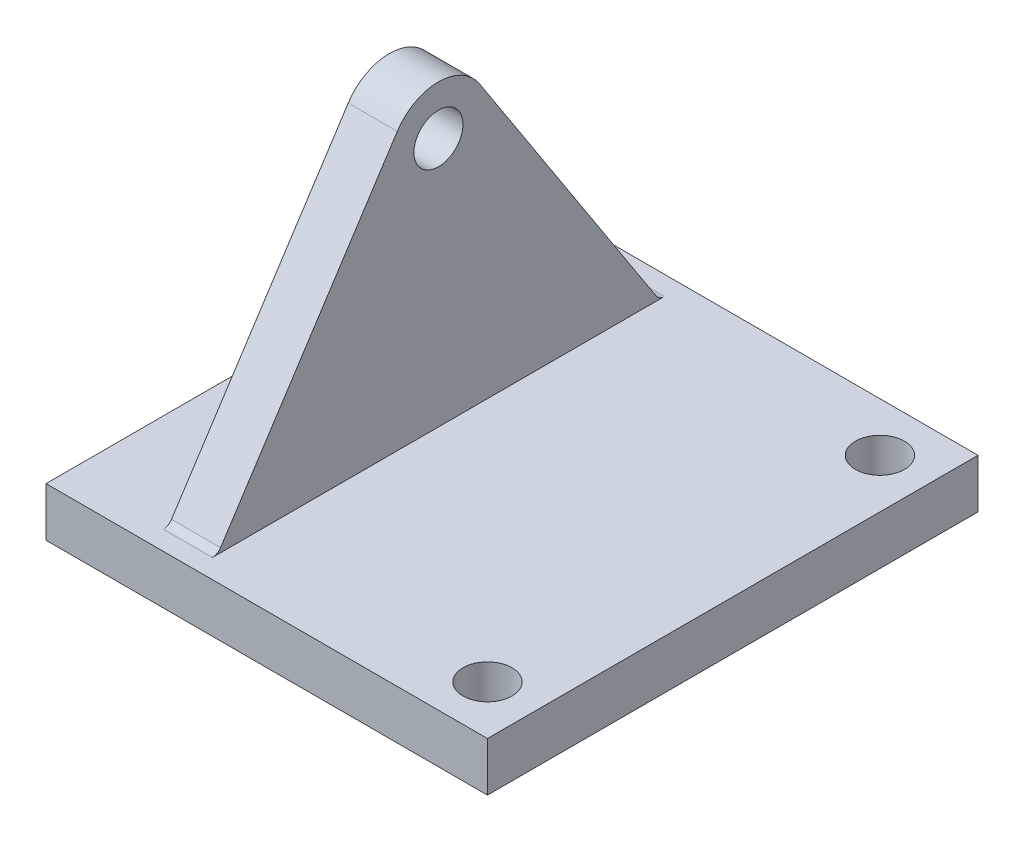
ISO-10303-21;
HEADER;
FILE_DESCRIPTION(('STEP AP214'),'2;1');
FILE_NAME('part.step','',(''),(''),'','','');
FILE_SCHEMA(('AUTOMOTIVE_DESIGN { 1 0 10303 214 1 1 1 1 }'));
ENDSEC;
DATA;
#1=APPLICATION_CONTEXT('core data for automotive mechanical design processes');
#2=APPLICATION_PROTOCOL_DEFINITION('international standard','automotive_design',2000,#1);
#3=PRODUCT_CONTEXT('',#1,'mechanical');
#4=PRODUCT('Part','Part','',(#3));
#5=PRODUCT_RELATED_PRODUCT_CATEGORY('part','',(#4));
#6=PRODUCT_DEFINITION_FORMATION('','',#4);
#7=PRODUCT_DEFINITION_CONTEXT('part definition',#1,'design');
#8=PRODUCT_DEFINITION('design','',#6,#7);
#9=PRODUCT_DEFINITION_SHAPE('','',#8);
#10=(LENGTH_UNIT() NAMED_UNIT(*) SI_UNIT(.MILLI.,.METRE.));
#11=(NAMED_UNIT(*) PLANE_ANGLE_UNIT() SI_UNIT($,.RADIAN.));
#12=(NAMED_UNIT(*) SI_UNIT($,.STERADIAN.) SOLID_ANGLE_UNIT());
#13=UNCERTAINTY_MEASURE_WITH_UNIT(LENGTH_MEASURE(1.E-05),#10,'distance_accuracy_value','');
#14=(GEOMETRIC_REPRESENTATION_CONTEXT(3) GLOBAL_UNCERTAINTY_ASSIGNED_CONTEXT((#13)) GLOBAL_UNIT_ASSIGNED_CONTEXT((#10,
#11,#12)) REPRESENTATION_CONTEXT('',''));
#15=CARTESIAN_POINT('',(0.,0.,0.));
#16=DIRECTION('',(0.,0.,1.));
#17=DIRECTION('',(1.,0.,0.));
#18=AXIS2_PLACEMENT_3D('',#15,#16,#17);
#19=CARTESIAN_POINT('',(-20.,-5.,0.));
#20=DIRECTION('',(0.,-1.,0.));
#21=DIRECTION('',(0.,0.,-1.));
#22=AXIS2_PLACEMENT_3D('',#19,#20,#21);
#23=PLANE('',#22);
#24=CARTESIAN_POINT('',(60.,-5.,-40.));
#25=DIRECTION('',(0.,1.,0.));
#26=DIRECTION('',(0.,0.,1.));
#27=AXIS2_PLACEMENT_3D('',#24,#25,#26);
#28=CIRCLE('',#27,5.);
#29=CARTESIAN_POINT('',(60.,-5.,-35.));
#30=VERTEX_POINT('',#29);
#31=EDGE_CURVE('E140',#30,#30,#28,.T.);
#32=ORIENTED_EDGE('',*,*,#31,.T.);
#33=EDGE_LOOP('',(#32));
#34=FACE_BOUND('',#33,.T.);
#35=DIRECTION('',(1.,0.,0.));
#36=VECTOR('',#35,1.);
#37=CARTESIAN_POINT('',(-20.,-5.,-50.));
#38=LINE('',#37,#36);
#39=CARTESIAN_POINT('',(-20.,-5.,-50.));
#40=VERTEX_POINT('',#39);
#41=CARTESIAN_POINT('',(70.,-5.,-50.));
#42=VERTEX_POINT('',#41);
#43=EDGE_CURVE('E111',#40,#42,#38,.T.);
#44=ORIENTED_EDGE('',*,*,#43,.T.);
#45=DIRECTION('',(0.,0.,-1.));
#46=VECTOR('',#45,1.);
#47=CARTESIAN_POINT('',(70.,-5.,0.));
#48=LINE('',#47,#46);
#49=CARTESIAN_POINT('',(70.,-5.,50.));
#50=VERTEX_POINT('',#49);
#51=EDGE_CURVE('E115',#50,#42,#48,.T.);
#52=ORIENTED_EDGE('',*,*,#51,.F.);
#53=DIRECTION('',(1.,0.,0.));
#54=VECTOR('',#53,1.);
#55=CARTESIAN_POINT('',(-20.,-5.,50.));
#56=LINE('',#55,#54);
#57=CARTESIAN_POINT('',(-20.,-5.,50.));
#58=VERTEX_POINT('',#57);
#59=EDGE_CURVE('E152',#58,#50,#56,.T.);
#60=ORIENTED_EDGE('',*,*,#59,.F.);
#61=DIRECTION('',(0.,0.,-1.));
#62=VECTOR('',#61,1.);
#63=CARTESIAN_POINT('',(-20.,-5.,0.));
#64=LINE('',#63,#62);
#65=EDGE_CURVE('E118',#58,#40,#64,.T.);
#66=ORIENTED_EDGE('',*,*,#65,.T.);
#67=EDGE_LOOP('',(#44,#52,#60,#66));
#68=FACE_BOUND('',#67,.T.);
#69=CARTESIAN_POINT('',(60.,-5.,40.));
#70=DIRECTION('',(0.,1.,0.));
#71=DIRECTION('',(0.,0.,1.));
#72=AXIS2_PLACEMENT_3D('',#69,#70,#71);
#73=CIRCLE('',#72,5.);
#74=CARTESIAN_POINT('',(60.,-5.,45.));
#75=VERTEX_POINT('',#74);
#76=EDGE_CURVE('E277',#75,#75,#73,.T.);
#77=ORIENTED_EDGE('',*,*,#76,.T.);
#78=EDGE_LOOP('',(#77));
#79=FACE_BOUND('',#78,.T.);
#80=ADVANCED_FACE('F35',(#34,#68,#79),#23,.T.);
#81=CARTESIAN_POINT('',(-20.,5.,0.));
#82=DIRECTION('',(0.,-1.,0.));
#83=DIRECTION('',(0.,0.,-1.));
#84=AXIS2_PLACEMENT_3D('',#81,#82,#83);
#85=PLANE('',#84);
#86=CARTESIAN_POINT('',(60.,5.,-40.));
#87=DIRECTION('',(0.,1.,0.));
#88=DIRECTION('',(0.,0.,1.));
#89=AXIS2_PLACEMENT_3D('',#86,#87,#88);
#90=CIRCLE('',#89,5.);
#91=CARTESIAN_POINT('',(60.,5.,-35.));
#92=VERTEX_POINT('',#91);
#93=EDGE_CURVE('E137',#92,#92,#90,.T.);
#94=ORIENTED_EDGE('',*,*,#93,.F.);
#95=EDGE_LOOP('',(#94));
#96=FACE_BOUND('',#95,.T.);
#97=DIRECTION('',(-1.,0.,0.));
#98=VECTOR('',#97,1.);
#99=CARTESIAN_POINT('',(-20.,5.,46.0859434255799));
#100=LINE('',#99,#98);
#101=CARTESIAN_POINT('',(10.,5.,46.0859434255799));
#102=VERTEX_POINT('',#101);
#103=CARTESIAN_POINT('',(0.,5.,46.0859434255799));
#104=VERTEX_POINT('',#103);
#105=EDGE_CURVE('E190',#102,#104,#100,.T.);
#106=ORIENTED_EDGE('',*,*,#105,.T.);
#107=DIRECTION('',(0.,0.,-1.));
#108=VECTOR('',#107,1.);
#109=CARTESIAN_POINT('',(0.,5.,0.));
#110=LINE('',#109,#108);
#111=CARTESIAN_POINT('',(0.,5.,-46.08594342558));
#112=VERTEX_POINT('',#111);
#113=EDGE_CURVE('E162',#104,#112,#110,.T.);
#114=ORIENTED_EDGE('',*,*,#113,.T.);
#115=DIRECTION('',(-1.,0.,0.));
#116=VECTOR('',#115,1.);
#117=CARTESIAN_POINT('',(10.,5.,-46.08594342558));
#118=LINE('',#117,#116);
#119=CARTESIAN_POINT('',(10.,5.,-46.08594342558));
#120=VERTEX_POINT('',#119);
#121=EDGE_CURVE('E187',#112,#120,#118,.F.);
#122=ORIENTED_EDGE('',*,*,#121,.T.);
#123=DIRECTION('',(0.,0.,-1.));
#124=VECTOR('',#123,1.);
#125=CARTESIAN_POINT('',(10.,5.,0.));
#126=LINE('',#125,#124);
#127=EDGE_CURVE('E169',#102,#120,#126,.T.);
#128=ORIENTED_EDGE('',*,*,#127,.F.);
#129=EDGE_LOOP('',(#106,#114,#122,#128));
#130=FACE_BOUND('',#129,.T.);
#131=DIRECTION('',(1.,0.,0.));
#132=VECTOR('',#131,1.);
#133=CARTESIAN_POINT('',(-20.,5.,50.));
#134=LINE('',#133,#132);
#135=CARTESIAN_POINT('',(-20.,5.,50.));
#136=VERTEX_POINT('',#135);
#137=CARTESIAN_POINT('',(70.,5.,50.));
#138=VERTEX_POINT('',#137);
#139=EDGE_CURVE('E155',#136,#138,#134,.T.);
#140=ORIENTED_EDGE('',*,*,#139,.T.);
#141=DIRECTION('',(0.,0.,-1.));
#142=VECTOR('',#141,1.);
#143=CARTESIAN_POINT('',(70.,5.,0.));
#144=LINE('',#143,#142);
#145=CARTESIAN_POINT('',(70.,5.,-50.));
#146=VERTEX_POINT('',#145);
#147=EDGE_CURVE('E132',#138,#146,#144,.T.);
#148=ORIENTED_EDGE('',*,*,#147,.T.);
#149=DIRECTION('',(1.,0.,0.));
#150=VECTOR('',#149,1.);
#151=CARTESIAN_POINT('',(-20.,5.,-50.));
#152=LINE('',#151,#150);
#153=CARTESIAN_POINT('',(-20.,5.,-50.));
#154=VERTEX_POINT('',#153);
#155=EDGE_CURVE('E122',#154,#146,#152,.T.);
#156=ORIENTED_EDGE('',*,*,#155,.F.);
#157=DIRECTION('',(0.,0.,-1.));
#158=VECTOR('',#157,1.);
#159=CARTESIAN_POINT('',(-20.,5.,0.));
#160=LINE('',#159,#158);
#161=EDGE_CURVE('E149',#136,#154,#160,.T.);
#162=ORIENTED_EDGE('',*,*,#161,.F.);
#163=EDGE_LOOP('',(#140,#148,#156,#162));
#164=FACE_BOUND('',#163,.T.);
#165=CARTESIAN_POINT('',(60.,5.,40.));
#166=DIRECTION('',(0.,1.,0.));
#167=DIRECTION('',(0.,0.,1.));
#168=AXIS2_PLACEMENT_3D('',#165,#166,#167);
#169=CIRCLE('',#168,5.);
#170=CARTESIAN_POINT('',(60.,5.,45.));
#171=VERTEX_POINT('',#170);
#172=EDGE_CURVE('E274',#171,#171,#169,.T.);
#173=ORIENTED_EDGE('',*,*,#172,.F.);
#174=EDGE_LOOP('',(#173));
#175=FACE_BOUND('',#174,.T.);
#176=ADVANCED_FACE('F207',(#96,#130,#164,#175),#85,.F.);
#177=CARTESIAN_POINT('',(10.,22.0373654685831,-33.936404616269));
#178=DIRECTION('',(0.,-0.544618290857901,0.838684038993838));
#179=DIRECTION('',(0.,-0.838684038993838,-0.544618290857901));
#180=AXIS2_PLACEMENT_3D('',#177,#178,#179);
#181=PLANE('',#180);
#182=DIRECTION('',(0.,0.838684038993838,0.544618290857901));
#183=VECTOR('',#182,1.);
#184=CARTESIAN_POINT('',(10.,22.0373654685831,-33.936404616269));
#185=LINE('',#184,#183);
#186=CARTESIAN_POINT('',(10.,5.9107634182842,-44.4085753475923));
#187=VERTEX_POINT('',#186);
#188=CARTESIAN_POINT('',(10.,61.3823747706344,-8.38684038993839));
#189=VERTEX_POINT('',#188);
#190=EDGE_CURVE('E161',#187,#189,#185,.T.);
#191=ORIENTED_EDGE('',*,*,#190,.F.);
#192=DIRECTION('',(-1.,0.,0.));
#193=VECTOR('',#192,1.);
#194=CARTESIAN_POINT('',(0.,5.9107634182842,-44.4085753475923));
#195=LINE('',#194,#193);
#196=CARTESIAN_POINT('',(0.,5.9107634182842,-44.4085753475923));
#197=VERTEX_POINT('',#196);
#198=EDGE_CURVE('E195',#187,#197,#195,.T.);
#199=ORIENTED_EDGE('',*,*,#198,.T.);
#200=DIRECTION('',(0.,0.838684038993838,0.544618290857901));
#201=VECTOR('',#200,1.);
#202=CARTESIAN_POINT('',(0.,22.0373654685831,-33.936404616269));
#203=LINE('',#202,#201);
#204=CARTESIAN_POINT('',(0.,61.3823747706344,-8.38684038993839));
#205=VERTEX_POINT('',#204);
#206=EDGE_CURVE('E174',#197,#205,#203,.T.);
#207=ORIENTED_EDGE('',*,*,#206,.T.);
#208=DIRECTION('',(-1.,0.,0.));
#209=VECTOR('',#208,1.);
#210=CARTESIAN_POINT('',(10.,61.3823747706344,-8.38684038993839));
#211=LINE('',#210,#209);
#212=EDGE_CURVE('E184',#189,#205,#211,.T.);
#213=ORIENTED_EDGE('',*,*,#212,.F.);
#214=EDGE_LOOP('',(#191,#199,#207,#213));
#215=FACE_BOUND('',#214,.T.);
#216=ADVANCED_FACE('F224',(#215),#181,.F.);
#217=CARTESIAN_POINT('',(10.,55.9361918620554,0.));
#218=DIRECTION('',(-1.,0.,0.));
#219=DIRECTION('',(0.,0.,1.));
#220=AXIS2_PLACEMENT_3D('',#217,#218,#219);
#221=CYLINDRICAL_SURFACE('',#220,9.99999999999999);
#222=CARTESIAN_POINT('',(0.,55.9361918620554,0.));
#223=DIRECTION('',(1.,0.,0.));
#224=DIRECTION('',(0.,0.,-1.));
#225=AXIS2_PLACEMENT_3D('',#222,#223,#224);
#226=CIRCLE('',#225,9.99999999999999);
#227=CARTESIAN_POINT('',(0.,61.3823747706344,8.38684038993835));
#228=VERTEX_POINT('',#227);
#229=EDGE_CURVE('E176',#205,#228,#226,.T.);
#230=ORIENTED_EDGE('',*,*,#229,.T.);
#231=DIRECTION('',(-1.,0.,0.));
#232=VECTOR('',#231,1.);
#233=CARTESIAN_POINT('',(10.,61.3823747706344,8.38684038993835));
#234=LINE('',#233,#232);
#235=CARTESIAN_POINT('',(10.,61.3823747706344,8.38684038993835));
#236=VERTEX_POINT('',#235);
#237=EDGE_CURVE('E171',#236,#228,#234,.T.);
#238=ORIENTED_EDGE('',*,*,#237,.F.);
#239=CARTESIAN_POINT('',(10.,55.9361918620554,0.));
#240=DIRECTION('',(1.,0.,0.));
#241=DIRECTION('',(0.,0.,-1.));
#242=AXIS2_PLACEMENT_3D('',#239,#240,#241);
#243=CIRCLE('',#242,9.99999999999999);
#244=EDGE_CURVE('E164',#189,#236,#243,.T.);
#245=ORIENTED_EDGE('',*,*,#244,.F.);
#246=ORIENTED_EDGE('',*,*,#212,.T.);
#247=EDGE_LOOP('',(#230,#238,#245,#246));
#248=FACE_BOUND('',#247,.T.);
#249=ADVANCED_FACE('F221',(#248),#221,.T.);
#250=CARTESIAN_POINT('',(10.,22.0373654685831,33.936404616269));
#251=DIRECTION('',(0.,0.544618290857901,0.838684038993838));
#252=DIRECTION('',(0.,-0.838684038993838,0.544618290857901));
#253=AXIS2_PLACEMENT_3D('',#250,#251,#252);
#254=PLANE('',#253);
#255=DIRECTION('',(0.,0.838684038993838,-0.544618290857901));
#256=VECTOR('',#255,1.);
#257=CARTESIAN_POINT('',(0.,22.0373654685831,33.936404616269));
#258=LINE('',#257,#256);
#259=CARTESIAN_POINT('',(0.,5.9107634182842,44.4085753475923));
#260=VERTEX_POINT('',#259);
#261=EDGE_CURVE('E179',#260,#228,#258,.T.);
#262=ORIENTED_EDGE('',*,*,#261,.F.);
#263=DIRECTION('',(-1.,0.,0.));
#264=VECTOR('',#263,1.);
#265=CARTESIAN_POINT('',(10.,5.9107634182842,44.4085753475923));
#266=LINE('',#265,#264);
#267=CARTESIAN_POINT('',(10.,5.9107634182842,44.4085753475923));
#268=VERTEX_POINT('',#267);
#269=EDGE_CURVE('E193',#260,#268,#266,.F.);
#270=ORIENTED_EDGE('',*,*,#269,.T.);
#271=DIRECTION('',(0.,0.838684038993838,-0.544618290857901));
#272=VECTOR('',#271,1.);
#273=CARTESIAN_POINT('',(10.,22.0373654685831,33.936404616269));
#274=LINE('',#273,#272);
#275=EDGE_CURVE('E167',#268,#236,#274,.T.);
#276=ORIENTED_EDGE('',*,*,#275,.T.);
#277=ORIENTED_EDGE('',*,*,#237,.T.);
#278=EDGE_LOOP('',(#262,#270,#276,#277));
#279=FACE_BOUND('',#278,.T.);
#280=ADVANCED_FACE('F216',(#279),#254,.T.);
#281=CARTESIAN_POINT('',(10.,55.9361918620554,0.));
#282=DIRECTION('',(-1.,0.,0.));
#283=DIRECTION('',(0.,0.,1.));
#284=AXIS2_PLACEMENT_3D('',#281,#282,#283);
#285=CYLINDRICAL_SURFACE('',#284,5.);
#286=CARTESIAN_POINT('',(10.,55.9361918620554,0.));
#287=DIRECTION('',(1.,0.,0.));
#288=DIRECTION('',(0.,0.,-1.));
#289=AXIS2_PLACEMENT_3D('',#286,#287,#288);
#290=CIRCLE('',#289,5.);
#291=CARTESIAN_POINT('',(10.,55.9361918620554,-5.00000000000001));
#292=VERTEX_POINT('',#291);
#293=EDGE_CURVE('E158',#292,#292,#290,.T.);
#294=ORIENTED_EDGE('',*,*,#293,.T.);
#295=EDGE_LOOP('',(#294));
#296=FACE_BOUND('',#295,.T.);
#297=CARTESIAN_POINT('',(0.,55.9361918620554,0.));
#298=DIRECTION('',(1.,0.,0.));
#299=DIRECTION('',(0.,0.,-1.));
#300=AXIS2_PLACEMENT_3D('',#297,#298,#299);
#301=CIRCLE('',#300,5.);
#302=CARTESIAN_POINT('',(0.,55.9361918620554,-5.00000000000001));
#303=VERTEX_POINT('',#302);
#304=EDGE_CURVE('E154',#303,#303,#301,.T.);
#305=ORIENTED_EDGE('',*,*,#304,.F.);
#306=EDGE_LOOP('',(#305));
#307=FACE_BOUND('',#306,.T.);
#308=ADVANCED_FACE('F227',(#296,#307),#285,.F.);
#309=CARTESIAN_POINT('',(10.,0.,0.));
#310=DIRECTION('',(1.,0.,0.));
#311=DIRECTION('',(0.,0.,-1.));
#312=AXIS2_PLACEMENT_3D('',#309,#310,#311);
#313=PLANE('',#312);
#314=ORIENTED_EDGE('',*,*,#293,.F.);
#315=EDGE_LOOP('',(#314));
#316=FACE_BOUND('',#315,.T.);
#317=ORIENTED_EDGE('',*,*,#127,.T.);
#318=CARTESIAN_POINT('',(10.,7.,-46.08594342558));
#319=DIRECTION('',(1.,0.,0.));
#320=DIRECTION('',(0.,0.,-1.));
#321=AXIS2_PLACEMENT_3D('',#318,#319,#320);
#322=CIRCLE('',#321,2.);
#323=EDGE_CURVE('E11',#120,#187,#322,.F.);
#324=ORIENTED_EDGE('',*,*,#323,.T.);
#325=ORIENTED_EDGE('',*,*,#190,.T.);
#326=ORIENTED_EDGE('',*,*,#244,.T.);
#327=ORIENTED_EDGE('',*,*,#275,.F.);
#328=CARTESIAN_POINT('',(10.,7.,46.0859434255799));
#329=DIRECTION('',(1.,0.,0.));
#330=DIRECTION('',(0.,0.,-1.));
#331=AXIS2_PLACEMENT_3D('',#328,#329,#330);
#332=CIRCLE('',#331,2.);
#333=EDGE_CURVE('E199',#268,#102,#332,.F.);
#334=ORIENTED_EDGE('',*,*,#333,.T.);
#335=EDGE_LOOP('',(#317,#324,#325,#326,#327,#334));
#336=FACE_BOUND('',#335,.T.);
#337=ADVANCED_FACE('F225',(#316,#336),#313,.T.);
#338=CARTESIAN_POINT('',(0.,0.,0.));
#339=DIRECTION('',(1.,0.,0.));
#340=DIRECTION('',(0.,0.,-1.));
#341=AXIS2_PLACEMENT_3D('',#338,#339,#340);
#342=PLANE('',#341);
#343=ORIENTED_EDGE('',*,*,#304,.T.);
#344=EDGE_LOOP('',(#343));
#345=FACE_BOUND('',#344,.T.);
#346=ORIENTED_EDGE('',*,*,#206,.F.);
#347=CARTESIAN_POINT('',(0.,7.,-46.08594342558));
#348=DIRECTION('',(1.,0.,0.));
#349=DIRECTION('',(0.,0.,-1.));
#350=AXIS2_PLACEMENT_3D('',#347,#348,#349);
#351=CIRCLE('',#350,2.);
#352=EDGE_CURVE('E43',#197,#112,#351,.T.);
#353=ORIENTED_EDGE('',*,*,#352,.T.);
#354=ORIENTED_EDGE('',*,*,#113,.F.);
#355=CARTESIAN_POINT('',(0.,7.,46.0859434255799));
#356=DIRECTION('',(1.,0.,0.));
#357=DIRECTION('',(0.,0.,-1.));
#358=AXIS2_PLACEMENT_3D('',#355,#356,#357);
#359=CIRCLE('',#358,2.);
#360=EDGE_CURVE('E197',#104,#260,#359,.T.);
#361=ORIENTED_EDGE('',*,*,#360,.T.);
#362=ORIENTED_EDGE('',*,*,#261,.T.);
#363=ORIENTED_EDGE('',*,*,#229,.F.);
#364=EDGE_LOOP('',(#346,#353,#354,#361,#362,#363));
#365=FACE_BOUND('',#364,.T.);
#366=ADVANCED_FACE('F203',(#345,#365),#342,.F.);
#367=CARTESIAN_POINT('',(-20.,0.,50.));
#368=DIRECTION('',(0.,0.,-1.));
#369=DIRECTION('',(-1.,0.,0.));
#370=AXIS2_PLACEMENT_3D('',#367,#368,#369);
#371=PLANE('',#370);
#372=ORIENTED_EDGE('',*,*,#59,.T.);
#373=DIRECTION('',(0.,1.,0.));
#374=VECTOR('',#373,1.);
#375=CARTESIAN_POINT('',(70.,0.,50.));
#376=LINE('',#375,#374);
#377=EDGE_CURVE('E136',#50,#138,#376,.T.);
#378=ORIENTED_EDGE('',*,*,#377,.T.);
#379=ORIENTED_EDGE('',*,*,#139,.F.);
#380=DIRECTION('',(0.,1.,0.));
#381=VECTOR('',#380,1.);
#382=CARTESIAN_POINT('',(-20.,0.,50.));
#383=LINE('',#382,#381);
#384=EDGE_CURVE('E123',#58,#136,#383,.T.);
#385=ORIENTED_EDGE('',*,*,#384,.F.);
#386=EDGE_LOOP('',(#372,#378,#379,#385));
#387=FACE_BOUND('',#386,.T.);
#388=ADVANCED_FACE('F234',(#387),#371,.F.);
#389=CARTESIAN_POINT('',(-20.,0.,-50.));
#390=DIRECTION('',(0.,0.,-1.));
#391=DIRECTION('',(0.,1.,0.));
#392=AXIS2_PLACEMENT_3D('',#389,#390,#391);
#393=PLANE('',#392);
#394=ORIENTED_EDGE('',*,*,#155,.T.);
#395=DIRECTION('',(0.,1.,0.));
#396=VECTOR('',#395,1.);
#397=CARTESIAN_POINT('',(70.,0.,-50.));
#398=LINE('',#397,#396);
#399=EDGE_CURVE('E126',#42,#146,#398,.T.);
#400=ORIENTED_EDGE('',*,*,#399,.F.);
#401=ORIENTED_EDGE('',*,*,#43,.F.);
#402=DIRECTION('',(0.,1.,0.));
#403=VECTOR('',#402,1.);
#404=CARTESIAN_POINT('',(-20.,0.,-50.));
#405=LINE('',#404,#403);
#406=EDGE_CURVE('E147',#40,#154,#405,.T.);
#407=ORIENTED_EDGE('',*,*,#406,.T.);
#408=EDGE_LOOP('',(#394,#400,#401,#407));
#409=FACE_BOUND('',#408,.T.);
#410=ADVANCED_FACE('F127',(#409),#393,.T.);
#411=CARTESIAN_POINT('',(-20.,0.,0.));
#412=DIRECTION('',(1.,0.,0.));
#413=DIRECTION('',(0.,0.,-1.));
#414=AXIS2_PLACEMENT_3D('',#411,#412,#413);
#415=PLANE('',#414);
#416=ORIENTED_EDGE('',*,*,#65,.F.);
#417=ORIENTED_EDGE('',*,*,#384,.T.);
#418=ORIENTED_EDGE('',*,*,#161,.T.);
#419=ORIENTED_EDGE('',*,*,#406,.F.);
#420=EDGE_LOOP('',(#416,#417,#418,#419));
#421=FACE_BOUND('',#420,.T.);
#422=ADVANCED_FACE('F251',(#421),#415,.F.);
#423=CARTESIAN_POINT('',(70.,0.,0.));
#424=DIRECTION('',(1.,0.,0.));
#425=DIRECTION('',(0.,0.,-1.));
#426=AXIS2_PLACEMENT_3D('',#423,#424,#425);
#427=PLANE('',#426);
#428=ORIENTED_EDGE('',*,*,#51,.T.);
#429=ORIENTED_EDGE('',*,*,#399,.T.);
#430=ORIENTED_EDGE('',*,*,#147,.F.);
#431=ORIENTED_EDGE('',*,*,#377,.F.);
#432=EDGE_LOOP('',(#428,#429,#430,#431));
#433=FACE_BOUND('',#432,.T.);
#434=ADVANCED_FACE('F134',(#433),#427,.T.);
#435=CARTESIAN_POINT('',(60.,5.,-40.));
#436=DIRECTION('',(0.,-1.,0.));
#437=DIRECTION('',(0.,0.,-1.));
#438=AXIS2_PLACEMENT_3D('',#435,#436,#437);
#439=CYLINDRICAL_SURFACE('',#438,5.);
#440=ORIENTED_EDGE('',*,*,#93,.T.);
#441=EDGE_LOOP('',(#440));
#442=FACE_BOUND('',#441,.T.);
#443=ORIENTED_EDGE('',*,*,#31,.F.);
#444=EDGE_LOOP('',(#443));
#445=FACE_BOUND('',#444,.T.);
#446=ADVANCED_FACE('F261',(#442,#445),#439,.F.);
#447=CARTESIAN_POINT('',(60.,5.,40.));
#448=DIRECTION('',(0.,-1.,0.));
#449=DIRECTION('',(0.,0.,-1.));
#450=AXIS2_PLACEMENT_3D('',#447,#448,#449);
#451=CYLINDRICAL_SURFACE('',#450,5.);
#452=ORIENTED_EDGE('',*,*,#172,.T.);
#453=EDGE_LOOP('',(#452));
#454=FACE_BOUND('',#453,.T.);
#455=ORIENTED_EDGE('',*,*,#76,.F.);
#456=EDGE_LOOP('',(#455));
#457=FACE_BOUND('',#456,.T.);
#458=ADVANCED_FACE('F264',(#454,#457),#451,.F.);
#459=CARTESIAN_POINT('',(-20.,7.,46.0859434255799));
#460=DIRECTION('',(-1.,0.,0.));
#461=DIRECTION('',(0.,0.,1.));
#462=AXIS2_PLACEMENT_3D('',#459,#460,#461);
#463=CYLINDRICAL_SURFACE('',#462,2.);
#464=ORIENTED_EDGE('',*,*,#333,.F.);
#465=ORIENTED_EDGE('',*,*,#269,.F.);
#466=ORIENTED_EDGE('',*,*,#360,.F.);
#467=ORIENTED_EDGE('',*,*,#105,.F.);
#468=EDGE_LOOP('',(#464,#465,#466,#467));
#469=FACE_BOUND('',#468,.T.);
#470=ADVANCED_FACE('F212',(#469),#463,.F.);
#471=CARTESIAN_POINT('',(10.,7.,-46.08594342558));
#472=DIRECTION('',(1.,0.,0.));
#473=DIRECTION('',(0.,0.,-1.));
#474=AXIS2_PLACEMENT_3D('',#471,#472,#473);
#475=CYLINDRICAL_SURFACE('',#474,2.);
#476=ORIENTED_EDGE('',*,*,#323,.F.);
#477=ORIENTED_EDGE('',*,*,#121,.F.);
#478=ORIENTED_EDGE('',*,*,#352,.F.);
#479=ORIENTED_EDGE('',*,*,#198,.F.);
#480=EDGE_LOOP('',(#476,#477,#478,#479));
#481=FACE_BOUND('',#480,.T.);
#482=ADVANCED_FACE('F37',(#481),#475,.F.);
#483=CLOSED_SHELL('',(#80,#176,#216,#249,#280,#308,#337,#366,#388,#410,#422,#434,#446,#458,#470,#482));
#484=MANIFOLD_SOLID_BREP('B2',#483);
#485=ADVANCED_BREP_SHAPE_REPRESENTATION('',(#18,#484),#14);
#486=SHAPE_DEFINITION_REPRESENTATION(#9,#485);
ENDSEC;
END-ISO-10303-21;
